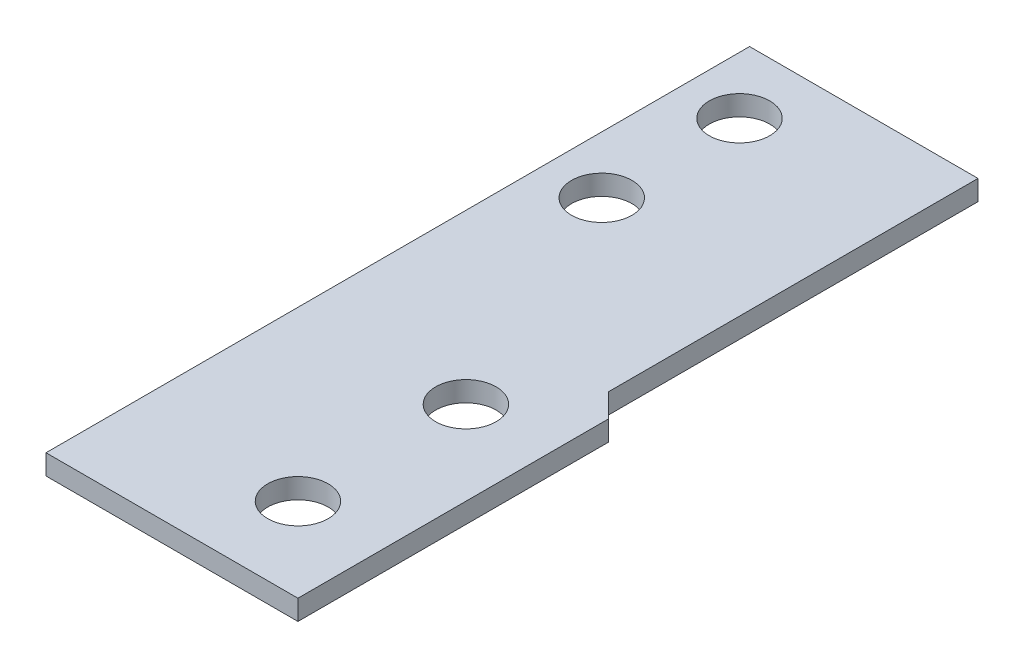
ISO-10303-21;
HEADER;
FILE_DESCRIPTION(('STEP AP214'),'2;1');
FILE_NAME('part.step','',(''),(''),'','','');
FILE_SCHEMA(('AUTOMOTIVE_DESIGN { 1 0 10303 214 1 1 1 1 }'));
ENDSEC;
DATA;
#1=APPLICATION_CONTEXT('core data for automotive mechanical design processes');
#2=APPLICATION_PROTOCOL_DEFINITION('international standard','automotive_design',2000,#1);
#3=PRODUCT_CONTEXT('',#1,'mechanical');
#4=PRODUCT('Part','Part','',(#3));
#5=PRODUCT_RELATED_PRODUCT_CATEGORY('part','',(#4));
#6=PRODUCT_DEFINITION_FORMATION('','',#4);
#7=PRODUCT_DEFINITION_CONTEXT('part definition',#1,'design');
#8=PRODUCT_DEFINITION('design','',#6,#7);
#9=PRODUCT_DEFINITION_SHAPE('','',#8);
#10=(LENGTH_UNIT() NAMED_UNIT(*) SI_UNIT(.MILLI.,.METRE.));
#11=(NAMED_UNIT(*) PLANE_ANGLE_UNIT() SI_UNIT($,.RADIAN.));
#12=(NAMED_UNIT(*) SI_UNIT($,.STERADIAN.) SOLID_ANGLE_UNIT());
#13=UNCERTAINTY_MEASURE_WITH_UNIT(LENGTH_MEASURE(1.E-05),#10,'distance_accuracy_value','');
#14=(GEOMETRIC_REPRESENTATION_CONTEXT(3) GLOBAL_UNCERTAINTY_ASSIGNED_CONTEXT((#13)) GLOBAL_UNIT_ASSIGNED_CONTEXT((#10,
#11,#12)) REPRESENTATION_CONTEXT('',''));
#15=CARTESIAN_POINT('',(0.,0.,0.));
#16=DIRECTION('',(0.,0.,1.));
#17=DIRECTION('',(1.,0.,0.));
#18=AXIS2_PLACEMENT_3D('',#15,#16,#17);
#19=CARTESIAN_POINT('',(91.7499999999886,-98.8000000000112,28.027756813564));
#20=DIRECTION('',(0.,1.,0.));
#21=DIRECTION('',(0.,0.,1.));
#22=AXIS2_PLACEMENT_3D('',#19,#20,#21);
#23=PLANE('',#22);
#24=CARTESIAN_POINT('',(93.000000000009,-98.8000000000112,36.0000000000084));
#25=DIRECTION('',(0.,1.,0.));
#26=DIRECTION('',(0.,0.,1.));
#27=AXIS2_PLACEMENT_3D('',#24,#25,#26);
#28=CIRCLE('',#27,0.899999999999956);
#29=CARTESIAN_POINT('',(93.000000000009,-98.8000000000112,36.9000000000084));
#30=VERTEX_POINT('',#29);
#31=EDGE_CURVE('E106',#30,#30,#28,.T.);
#32=ORIENTED_EDGE('',*,*,#31,.T.);
#33=EDGE_LOOP('',(#32));
#34=FACE_BOUND('',#33,.T.);
#35=CARTESIAN_POINT('',(93.000000000009,-98.8000000000112,31.000000000003));
#36=DIRECTION('',(0.,1.,0.));
#37=DIRECTION('',(0.,0.,1.));
#38=AXIS2_PLACEMENT_3D('',#35,#36,#37);
#39=CIRCLE('',#38,0.899999999999956);
#40=CARTESIAN_POINT('',(93.000000000009,-98.8000000000112,31.900000000003));
#41=VERTEX_POINT('',#40);
#42=EDGE_CURVE('E110',#41,#41,#39,.T.);
#43=ORIENTED_EDGE('',*,*,#42,.T.);
#44=EDGE_LOOP('',(#43));
#45=FACE_BOUND('',#44,.T.);
#46=CARTESIAN_POINT('',(89.6999999999968,-98.8000000000112,23.6555136271306));
#47=DIRECTION('',(0.,1.,0.));
#48=DIRECTION('',(0.,0.,1.));
#49=AXIS2_PLACEMENT_3D('',#46,#47,#48);
#50=CIRCLE('',#49,0.899999999999956);
#51=CARTESIAN_POINT('',(89.6999999999968,-98.8000000000112,24.5555136271306));
#52=VERTEX_POINT('',#51);
#53=EDGE_CURVE('E112',#52,#52,#50,.T.);
#54=ORIENTED_EDGE('',*,*,#53,.T.);
#55=EDGE_LOOP('',(#54));
#56=FACE_BOUND('',#55,.T.);
#57=CARTESIAN_POINT('',(89.6999999999968,-98.8000000000112,19.5555136271292));
#58=DIRECTION('',(0.,1.,0.));
#59=DIRECTION('',(0.,0.,1.));
#60=AXIS2_PLACEMENT_3D('',#57,#58,#59);
#61=CIRCLE('',#60,0.899999999999956);
#62=CARTESIAN_POINT('',(89.6999999999968,-98.8000000000112,20.4555136271292));
#63=VERTEX_POINT('',#62);
#64=EDGE_CURVE('E22',#63,#63,#61,.T.);
#65=ORIENTED_EDGE('',*,*,#64,.T.);
#66=EDGE_LOOP('',(#65));
#67=FACE_BOUND('',#66,.T.);
#68=DIRECTION('',(0.,0.,-1.));
#69=VECTOR('',#68,1.);
#70=CARTESIAN_POINT('',(95.499999999999,-98.8000000000112,33.877756813566));
#71=LINE('',#70,#69);
#72=CARTESIAN_POINT('',(95.499999999999,-98.8000000000112,38.4999999999984));
#73=VERTEX_POINT('',#72);
#74=CARTESIAN_POINT('',(95.499999999999,-98.8000000000112,29.2555136271336));
#75=VERTEX_POINT('',#74);
#76=EDGE_CURVE('E132',#73,#75,#71,.T.);
#77=ORIENTED_EDGE('',*,*,#76,.F.);
#78=DIRECTION('',(1.,0.,0.));
#79=VECTOR('',#78,1.);
#80=CARTESIAN_POINT('',(91.7499999999886,-98.8000000000112,38.4999999999984));
#81=LINE('',#80,#79);
#82=CARTESIAN_POINT('',(88.0000000000036,-98.8000000000112,38.4999999999984));
#83=VERTEX_POINT('',#82);
#84=EDGE_CURVE('E77',#83,#73,#81,.T.);
#85=ORIENTED_EDGE('',*,*,#84,.F.);
#86=DIRECTION('',(0.,0.,-1.));
#87=VECTOR('',#86,1.);
#88=CARTESIAN_POINT('',(88.0000000000036,-98.8000000000112,28.027756813564));
#89=LINE('',#88,#87);
#90=CARTESIAN_POINT('',(88.0000000000036,-98.8000000000112,17.5555136271296));
#91=VERTEX_POINT('',#90);
#92=EDGE_CURVE('E69',#83,#91,#89,.T.);
#93=ORIENTED_EDGE('',*,*,#92,.T.);
#94=DIRECTION('',(1.,0.,0.));
#95=VECTOR('',#94,1.);
#96=CARTESIAN_POINT('',(91.39999999999,-98.8000000000112,17.5555136271296));
#97=LINE('',#96,#95);
#98=CARTESIAN_POINT('',(94.8000000000018,-98.8000000000112,17.5555136271296));
#99=VERTEX_POINT('',#98);
#100=EDGE_CURVE('E75',#91,#99,#97,.T.);
#101=ORIENTED_EDGE('',*,*,#100,.T.);
#102=DIRECTION('',(0.,0.,-1.));
#103=VECTOR('',#102,1.);
#104=CARTESIAN_POINT('',(94.8000000000018,-98.8000000000112,23.0555136271305));
#105=LINE('',#104,#103);
#106=CARTESIAN_POINT('',(94.8000000000018,-98.8000000000112,28.5555136271364));
#107=VERTEX_POINT('',#106);
#108=EDGE_CURVE('E117',#107,#99,#105,.T.);
#109=ORIENTED_EDGE('',*,*,#108,.F.);
#110=DIRECTION('',(-0.707106781186548,0.,-0.707106781186548));
#111=VECTOR('',#110,1.);
#112=CARTESIAN_POINT('',(95.1500000000004,-98.8000000000112,28.905513627135));
#113=LINE('',#112,#111);
#114=EDGE_CURVE('E127',#75,#107,#113,.T.);
#115=ORIENTED_EDGE('',*,*,#114,.F.);
#116=EDGE_LOOP('',(#77,#85,#93,#101,#109,#115));
#117=FACE_BOUND('',#116,.T.);
#118=ADVANCED_FACE('F19',(#34,#45,#56,#67,#117),#23,.F.);
#119=CARTESIAN_POINT('',(91.39999999999,-98.5000000000124,17.5555136271296));
#120=DIRECTION('',(0.,0.,1.));
#121=DIRECTION('',(1.,0.,0.));
#122=AXIS2_PLACEMENT_3D('',#119,#120,#121);
#123=PLANE('',#122);
#124=DIRECTION('',(0.,1.,0.));
#125=VECTOR('',#124,1.);
#126=CARTESIAN_POINT('',(88.0000000000036,-98.5000000000124,17.5555136271296));
#127=LINE('',#126,#125);
#128=CARTESIAN_POINT('',(88.0000000000036,-98.1999999999882,17.5555136271296));
#129=VERTEX_POINT('',#128);
#130=EDGE_CURVE('E79',#91,#129,#127,.T.);
#131=ORIENTED_EDGE('',*,*,#130,.T.);
#132=DIRECTION('',(1.,0.,0.));
#133=VECTOR('',#132,1.);
#134=CARTESIAN_POINT('',(91.7499999999886,-98.1999999999882,17.5555136271296));
#135=LINE('',#134,#133);
#136=CARTESIAN_POINT('',(94.8000000000018,-98.1999999999882,17.5555136271296));
#137=VERTEX_POINT('',#136);
#138=EDGE_CURVE('E109',#137,#129,#135,.F.);
#139=ORIENTED_EDGE('',*,*,#138,.F.);
#140=DIRECTION('',(0.,1.,0.));
#141=VECTOR('',#140,1.);
#142=CARTESIAN_POINT('',(94.8000000000018,-98.5000000000124,17.5555136271296));
#143=LINE('',#142,#141);
#144=EDGE_CURVE('E85',#99,#137,#143,.T.);
#145=ORIENTED_EDGE('',*,*,#144,.F.);
#146=ORIENTED_EDGE('',*,*,#100,.F.);
#147=EDGE_LOOP('',(#131,#139,#145,#146));
#148=FACE_BOUND('',#147,.T.);
#149=ADVANCED_FACE('F82',(#148),#123,.F.);
#150=CARTESIAN_POINT('',(88.0000000000036,-98.5000000000124,28.027756813564));
#151=DIRECTION('',(1.,0.,0.));
#152=DIRECTION('',(0.,0.,-1.));
#153=AXIS2_PLACEMENT_3D('',#150,#151,#152);
#154=PLANE('',#153);
#155=DIRECTION('',(0.,0.,1.));
#156=VECTOR('',#155,1.);
#157=CARTESIAN_POINT('',(88.0000000000036,-98.1999999999882,28.027756813564));
#158=LINE('',#157,#156);
#159=CARTESIAN_POINT('',(88.0000000000036,-98.1999999999882,38.4999999999984));
#160=VERTEX_POINT('',#159);
#161=EDGE_CURVE('E90',#129,#160,#158,.T.);
#162=ORIENTED_EDGE('',*,*,#161,.F.);
#163=ORIENTED_EDGE('',*,*,#130,.F.);
#164=ORIENTED_EDGE('',*,*,#92,.F.);
#165=DIRECTION('',(0.,1.,0.));
#166=VECTOR('',#165,1.);
#167=CARTESIAN_POINT('',(88.0000000000036,-98.5000000000124,38.4999999999984));
#168=LINE('',#167,#166);
#169=EDGE_CURVE('E92',#160,#83,#168,.F.);
#170=ORIENTED_EDGE('',*,*,#169,.F.);
#171=EDGE_LOOP('',(#162,#163,#164,#170));
#172=FACE_BOUND('',#171,.T.);
#173=ADVANCED_FACE('F88',(#172),#154,.F.);
#174=CARTESIAN_POINT('',(91.7499999999886,-98.5000000000124,38.4999999999984));
#175=DIRECTION('',(0.,0.,1.));
#176=DIRECTION('',(1.,0.,0.));
#177=AXIS2_PLACEMENT_3D('',#174,#175,#176);
#178=PLANE('',#177);
#179=ORIENTED_EDGE('',*,*,#84,.T.);
#180=DIRECTION('',(0.,1.,0.));
#181=VECTOR('',#180,1.);
#182=CARTESIAN_POINT('',(95.499999999999,-98.5000000000124,38.4999999999984));
#183=LINE('',#182,#181);
#184=CARTESIAN_POINT('',(95.499999999999,-98.1999999999882,38.4999999999984));
#185=VERTEX_POINT('',#184);
#186=EDGE_CURVE('E134',#185,#73,#183,.F.);
#187=ORIENTED_EDGE('',*,*,#186,.F.);
#188=DIRECTION('',(1.,0.,0.));
#189=VECTOR('',#188,1.);
#190=CARTESIAN_POINT('',(91.7499999999886,-98.1999999999882,38.4999999999984));
#191=LINE('',#190,#189);
#192=EDGE_CURVE('E149',#160,#185,#191,.T.);
#193=ORIENTED_EDGE('',*,*,#192,.F.);
#194=ORIENTED_EDGE('',*,*,#169,.T.);
#195=EDGE_LOOP('',(#179,#187,#193,#194));
#196=FACE_BOUND('',#195,.T.);
#197=ADVANCED_FACE('F137',(#196),#178,.T.);
#198=CARTESIAN_POINT('',(95.499999999999,-98.5000000000124,33.877756813566));
#199=DIRECTION('',(1.,0.,0.));
#200=DIRECTION('',(0.,0.,-1.));
#201=AXIS2_PLACEMENT_3D('',#198,#199,#200);
#202=PLANE('',#201);
#203=ORIENTED_EDGE('',*,*,#186,.T.);
#204=ORIENTED_EDGE('',*,*,#76,.T.);
#205=DIRECTION('',(0.,1.,0.));
#206=VECTOR('',#205,1.);
#207=CARTESIAN_POINT('',(95.499999999999,-98.5000000000124,29.2555136271336));
#208=LINE('',#207,#206);
#209=CARTESIAN_POINT('',(95.499999999999,-98.1999999999882,29.2555136271336));
#210=VERTEX_POINT('',#209);
#211=EDGE_CURVE('E129',#210,#75,#208,.F.);
#212=ORIENTED_EDGE('',*,*,#211,.F.);
#213=DIRECTION('',(0.,0.,1.));
#214=VECTOR('',#213,1.);
#215=CARTESIAN_POINT('',(95.499999999999,-98.1999999999882,28.027756813564));
#216=LINE('',#215,#214);
#217=EDGE_CURVE('E144',#185,#210,#216,.F.);
#218=ORIENTED_EDGE('',*,*,#217,.F.);
#219=EDGE_LOOP('',(#203,#204,#212,#218));
#220=FACE_BOUND('',#219,.T.);
#221=ADVANCED_FACE('F142',(#220),#202,.T.);
#222=CARTESIAN_POINT('',(95.1500000000004,-98.5000000000124,28.905513627135));
#223=DIRECTION('',(0.707106781186548,0.,-0.707106781186548));
#224=DIRECTION('',(-0.707106781186548,0.,-0.707106781186548));
#225=AXIS2_PLACEMENT_3D('',#222,#223,#224);
#226=PLANE('',#225);
#227=ORIENTED_EDGE('',*,*,#211,.T.);
#228=ORIENTED_EDGE('',*,*,#114,.T.);
#229=DIRECTION('',(0.,1.,0.));
#230=VECTOR('',#229,1.);
#231=CARTESIAN_POINT('',(94.8000000000018,-98.5000000000124,28.5555136271364));
#232=LINE('',#231,#230);
#233=CARTESIAN_POINT('',(94.8000000000018,-98.1999999999882,28.5555136271364));
#234=VERTEX_POINT('',#233);
#235=EDGE_CURVE('E37',#234,#107,#232,.F.);
#236=ORIENTED_EDGE('',*,*,#235,.F.);
#237=DIRECTION('',(-0.707106781186544,0.,-0.707106781186551));
#238=VECTOR('',#237,1.);
#239=CARTESIAN_POINT('',(95.499999999999,-98.1999999999882,29.2555136271336));
#240=LINE('',#239,#238);
#241=EDGE_CURVE('E148',#210,#234,#240,.T.);
#242=ORIENTED_EDGE('',*,*,#241,.F.);
#243=EDGE_LOOP('',(#227,#228,#236,#242));
#244=FACE_BOUND('',#243,.T.);
#245=ADVANCED_FACE('F159',(#244),#226,.T.);
#246=CARTESIAN_POINT('',(94.8000000000018,-98.5000000000124,23.0555136271305));
#247=DIRECTION('',(1.,0.,0.));
#248=DIRECTION('',(0.,0.,-1.));
#249=AXIS2_PLACEMENT_3D('',#246,#247,#248);
#250=PLANE('',#249);
#251=ORIENTED_EDGE('',*,*,#235,.T.);
#252=ORIENTED_EDGE('',*,*,#108,.T.);
#253=ORIENTED_EDGE('',*,*,#144,.T.);
#254=DIRECTION('',(0.,0.,1.));
#255=VECTOR('',#254,1.);
#256=CARTESIAN_POINT('',(94.8000000000018,-98.1999999999882,28.027756813564));
#257=LINE('',#256,#255);
#258=EDGE_CURVE('E105',#234,#137,#257,.F.);
#259=ORIENTED_EDGE('',*,*,#258,.F.);
#260=EDGE_LOOP('',(#251,#252,#253,#259));
#261=FACE_BOUND('',#260,.T.);
#262=ADVANCED_FACE('F156',(#261),#250,.T.);
#263=CARTESIAN_POINT('',(89.6999999999968,-98.8267059052226,19.5555136271292));
#264=DIRECTION('',(0.,1.,0.));
#265=DIRECTION('',(0.,0.,1.));
#266=AXIS2_PLACEMENT_3D('',#263,#264,#265);
#267=CYLINDRICAL_SURFACE('',#266,0.899999999999956);
#268=ORIENTED_EDGE('',*,*,#64,.F.);
#269=EDGE_LOOP('',(#268));
#270=FACE_BOUND('',#269,.T.);
#271=CARTESIAN_POINT('',(89.6999999999968,-98.1999999999882,19.5555136271292));
#272=DIRECTION('',(0.,1.,0.));
#273=DIRECTION('',(0.,0.,1.));
#274=AXIS2_PLACEMENT_3D('',#271,#272,#273);
#275=CIRCLE('',#274,0.899999999999956);
#276=CARTESIAN_POINT('',(89.6999999999968,-98.1999999999882,20.4555136271292));
#277=VERTEX_POINT('',#276);
#278=EDGE_CURVE('E102',#277,#277,#275,.F.);
#279=ORIENTED_EDGE('',*,*,#278,.F.);
#280=EDGE_LOOP('',(#279));
#281=FACE_BOUND('',#280,.T.);
#282=ADVANCED_FACE('F158',(#270,#281),#267,.F.);
#283=CARTESIAN_POINT('',(89.6999999999968,-98.8267059052226,23.6555136271306));
#284=DIRECTION('',(0.,1.,0.));
#285=DIRECTION('',(0.,0.,1.));
#286=AXIS2_PLACEMENT_3D('',#283,#284,#285);
#287=CYLINDRICAL_SURFACE('',#286,0.899999999999956);
#288=ORIENTED_EDGE('',*,*,#53,.F.);
#289=EDGE_LOOP('',(#288));
#290=FACE_BOUND('',#289,.T.);
#291=CARTESIAN_POINT('',(89.6999999999968,-98.1999999999882,23.6555136271306));
#292=DIRECTION('',(0.,1.,0.));
#293=DIRECTION('',(0.,0.,1.));
#294=AXIS2_PLACEMENT_3D('',#291,#292,#293);
#295=CIRCLE('',#294,0.899999999999956);
#296=CARTESIAN_POINT('',(89.6999999999968,-98.1999999999882,24.5555136271306));
#297=VERTEX_POINT('',#296);
#298=EDGE_CURVE('E99',#297,#297,#295,.F.);
#299=ORIENTED_EDGE('',*,*,#298,.F.);
#300=EDGE_LOOP('',(#299));
#301=FACE_BOUND('',#300,.T.);
#302=ADVANCED_FACE('F166',(#290,#301),#287,.F.);
#303=CARTESIAN_POINT('',(93.000000000009,-98.8267059052226,31.000000000003));
#304=DIRECTION('',(0.,1.,0.));
#305=DIRECTION('',(0.,0.,1.));
#306=AXIS2_PLACEMENT_3D('',#303,#304,#305);
#307=CYLINDRICAL_SURFACE('',#306,0.899999999999956);
#308=CARTESIAN_POINT('',(93.000000000009,-98.1999999999882,31.000000000003));
#309=DIRECTION('',(0.,1.,0.));
#310=DIRECTION('',(0.,0.,1.));
#311=AXIS2_PLACEMENT_3D('',#308,#309,#310);
#312=CIRCLE('',#311,0.899999999999956);
#313=CARTESIAN_POINT('',(93.000000000009,-98.1999999999882,31.900000000003));
#314=VERTEX_POINT('',#313);
#315=EDGE_CURVE('E28',#314,#314,#312,.F.);
#316=ORIENTED_EDGE('',*,*,#315,.F.);
#317=EDGE_LOOP('',(#316));
#318=FACE_BOUND('',#317,.T.);
#319=ORIENTED_EDGE('',*,*,#42,.F.);
#320=EDGE_LOOP('',(#319));
#321=FACE_BOUND('',#320,.T.);
#322=ADVANCED_FACE('F177',(#318,#321),#307,.F.);
#323=CARTESIAN_POINT('',(93.000000000009,-98.8267059052226,36.0000000000084));
#324=DIRECTION('',(0.,1.,0.));
#325=DIRECTION('',(0.,0.,1.));
#326=AXIS2_PLACEMENT_3D('',#323,#324,#325);
#327=CYLINDRICAL_SURFACE('',#326,0.899999999999956);
#328=CARTESIAN_POINT('',(93.000000000009,-98.1999999999882,36.0000000000084));
#329=DIRECTION('',(0.,1.,0.));
#330=DIRECTION('',(0.,0.,1.));
#331=AXIS2_PLACEMENT_3D('',#328,#329,#330);
#332=CIRCLE('',#331,0.899999999999956);
#333=CARTESIAN_POINT('',(93.000000000009,-98.1999999999882,36.9000000000084));
#334=VERTEX_POINT('',#333);
#335=EDGE_CURVE('E11',#334,#334,#332,.F.);
#336=ORIENTED_EDGE('',*,*,#335,.F.);
#337=EDGE_LOOP('',(#336));
#338=FACE_BOUND('',#337,.T.);
#339=ORIENTED_EDGE('',*,*,#31,.F.);
#340=EDGE_LOOP('',(#339));
#341=FACE_BOUND('',#340,.T.);
#342=ADVANCED_FACE('F171',(#338,#341),#327,.F.);
#343=CARTESIAN_POINT('',(91.7499999999886,-98.1999999999882,28.027756813564));
#344=DIRECTION('',(0.,1.,0.));
#345=DIRECTION('',(0.,0.,1.));
#346=AXIS2_PLACEMENT_3D('',#343,#344,#345);
#347=PLANE('',#346);
#348=ORIENTED_EDGE('',*,*,#335,.T.);
#349=EDGE_LOOP('',(#348));
#350=FACE_BOUND('',#349,.T.);
#351=ORIENTED_EDGE('',*,*,#315,.T.);
#352=EDGE_LOOP('',(#351));
#353=FACE_BOUND('',#352,.T.);
#354=ORIENTED_EDGE('',*,*,#298,.T.);
#355=EDGE_LOOP('',(#354));
#356=FACE_BOUND('',#355,.T.);
#357=ORIENTED_EDGE('',*,*,#278,.T.);
#358=EDGE_LOOP('',(#357));
#359=FACE_BOUND('',#358,.T.);
#360=ORIENTED_EDGE('',*,*,#241,.T.);
#361=ORIENTED_EDGE('',*,*,#258,.T.);
#362=ORIENTED_EDGE('',*,*,#138,.T.);
#363=ORIENTED_EDGE('',*,*,#161,.T.);
#364=ORIENTED_EDGE('',*,*,#192,.T.);
#365=ORIENTED_EDGE('',*,*,#217,.T.);
#366=EDGE_LOOP('',(#360,#361,#362,#363,#364,#365));
#367=FACE_BOUND('',#366,.T.);
#368=ADVANCED_FACE('F151',(#350,#353,#356,#359,#367),#347,.T.);
#369=CLOSED_SHELL('',(#118,#149,#173,#197,#221,#245,#262,#282,#302,#322,#342,#368));
#370=MANIFOLD_SOLID_BREP('B1',#369);
#371=ADVANCED_BREP_SHAPE_REPRESENTATION('',(#18,#370),#14);
#372=SHAPE_DEFINITION_REPRESENTATION(#9,#371);
ENDSEC;
END-ISO-10303-21;
